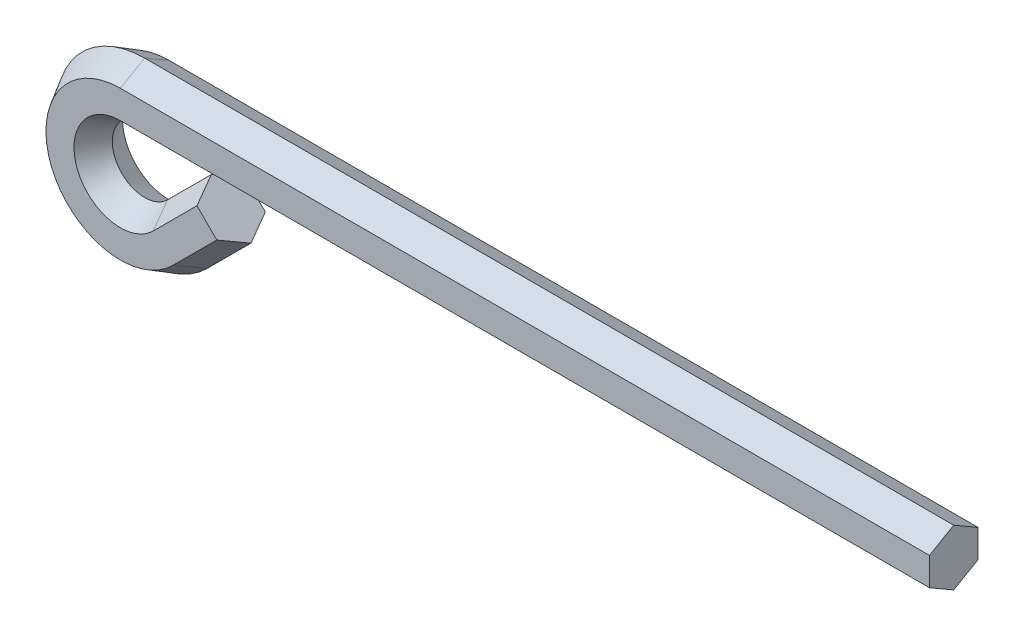
ISO-10303-21;
HEADER;
FILE_DESCRIPTION(('STEP AP214'),'2;1');
FILE_NAME('part.step','',(''),(''),'','','');
FILE_SCHEMA(('AUTOMOTIVE_DESIGN { 1 0 10303 214 1 1 1 1 }'));
ENDSEC;
DATA;
#1=APPLICATION_CONTEXT('core data for automotive mechanical design processes');
#2=APPLICATION_PROTOCOL_DEFINITION('international standard','automotive_design',2000,#1);
#3=PRODUCT_CONTEXT('',#1,'mechanical');
#4=PRODUCT('Part','Part','',(#3));
#5=PRODUCT_RELATED_PRODUCT_CATEGORY('part','',(#4));
#6=PRODUCT_DEFINITION_FORMATION('','',#4);
#7=PRODUCT_DEFINITION_CONTEXT('part definition',#1,'design');
#8=PRODUCT_DEFINITION('design','',#6,#7);
#9=PRODUCT_DEFINITION_SHAPE('','',#8);
#10=(LENGTH_UNIT() NAMED_UNIT(*) SI_UNIT(.MILLI.,.METRE.));
#11=(NAMED_UNIT(*) PLANE_ANGLE_UNIT() SI_UNIT($,.RADIAN.));
#12=(NAMED_UNIT(*) SI_UNIT($,.STERADIAN.) SOLID_ANGLE_UNIT());
#13=UNCERTAINTY_MEASURE_WITH_UNIT(LENGTH_MEASURE(1.E-05),#10,'distance_accuracy_value','');
#14=(GEOMETRIC_REPRESENTATION_CONTEXT(3) GLOBAL_UNCERTAINTY_ASSIGNED_CONTEXT((#13)) GLOBAL_UNIT_ASSIGNED_CONTEXT((#10,
#11,#12)) REPRESENTATION_CONTEXT('',''));
#15=CARTESIAN_POINT('',(0.,0.,0.));
#16=DIRECTION('',(0.,0.,1.));
#17=DIRECTION('',(1.,0.,0.));
#18=AXIS2_PLACEMENT_3D('',#15,#16,#17);
#19=CARTESIAN_POINT('',(6.50266173892101,-6.5026617389209,-3.));
#20=DIRECTION('',(-0.612372435695791,0.612372435695798,0.5));
#21=DIRECTION('',(-0.707106781186551,-0.707106781186544,0.));
#22=AXIS2_PLACEMENT_3D('',#19,#20,#21);
#23=PLANE('',#22);
#24=DIRECTION('',(0.353553390593277,-0.353553390593271,0.866025403784439));
#25=VECTOR('',#24,1.);
#26=CARTESIAN_POINT('',(6.50266173892101,-6.5026617389209,-3.));
#27=LINE('',#26,#25);
#28=CARTESIAN_POINT('',(6.50266173892101,-6.5026617389209,-3.));
#29=VERTEX_POINT('',#28);
#30=CARTESIAN_POINT('',(7.72740661031261,-7.72740661031248,0.));
#31=VERTEX_POINT('',#30);
#32=EDGE_CURVE('E133',#29,#31,#27,.T.);
#33=ORIENTED_EDGE('',*,*,#32,.F.);
#34=DIRECTION('',(0.707106781186551,0.707106781186544,0.));
#35=VECTOR('',#34,1.);
#36=CARTESIAN_POINT('',(6.50266173892101,-6.5026617389209,-3.));
#37=LINE('',#36,#35);
#38=CARTESIAN_POINT('',(11.9168753012942,-1.08844817654778,-3.));
#39=VERTEX_POINT('',#38);
#40=EDGE_CURVE('E42',#29,#39,#37,.T.);
#41=ORIENTED_EDGE('',*,*,#40,.T.);
#42=DIRECTION('',(0.353553390593277,-0.353553390593271,0.866025403784439));
#43=VECTOR('',#42,1.);
#44=CARTESIAN_POINT('',(11.9168753012942,-1.08844817654778,-3.));
#45=LINE('',#44,#43);
#46=CARTESIAN_POINT('',(13.1416201726858,-2.31319304793936,0.));
#47=VERTEX_POINT('',#46);
#48=EDGE_CURVE('E49',#39,#47,#45,.T.);
#49=ORIENTED_EDGE('',*,*,#48,.T.);
#50=DIRECTION('',(0.707106781186551,0.707106781186544,0.));
#51=VECTOR('',#50,1.);
#52=CARTESIAN_POINT('',(7.72740661031261,-7.72740661031248,0.));
#53=LINE('',#52,#51);
#54=EDGE_CURVE('E11',#31,#47,#53,.T.);
#55=ORIENTED_EDGE('',*,*,#54,.F.);
#56=EDGE_LOOP('',(#33,#41,#49,#55));
#57=FACE_BOUND('',#56,.T.);
#58=ADVANCED_FACE('F34',(#57),#23,.F.);
#59=CARTESIAN_POINT('',(2.82842712474621,-2.82842712474617,0.));
#60=DIRECTION('',(0.612372435695791,-0.612372435695798,0.5));
#61=DIRECTION('',(0.707106781186551,0.707106781186544,0.));
#62=AXIS2_PLACEMENT_3D('',#59,#60,#61);
#63=PLANE('',#62);
#64=DIRECTION('',(0.353553390593277,-0.353553390593271,-0.866025403784439));
#65=VECTOR('',#64,1.);
#66=CARTESIAN_POINT('',(2.82842712474621,-2.82842712474617,0.));
#67=LINE('',#66,#65);
#68=CARTESIAN_POINT('',(2.82842712474621,-2.82842712474617,0.));
#69=VERTEX_POINT('',#68);
#70=CARTESIAN_POINT('',(4.05317199613781,-4.05317199613775,-3.));
#71=VERTEX_POINT('',#70);
#72=EDGE_CURVE('E212',#69,#71,#67,.T.);
#73=ORIENTED_EDGE('',*,*,#72,.F.);
#74=DIRECTION('',(0.707106781186551,0.707106781186544,0.));
#75=VECTOR('',#74,1.);
#76=CARTESIAN_POINT('',(2.82842712474621,-2.82842712474617,0.));
#77=LINE('',#76,#75);
#78=CARTESIAN_POINT('',(8.24264068711939,2.58578643762695,0.));
#79=VERTEX_POINT('',#78);
#80=EDGE_CURVE('E256',#69,#79,#77,.T.);
#81=ORIENTED_EDGE('',*,*,#80,.T.);
#82=DIRECTION('',(0.353553390593277,-0.353553390593271,-0.866025403784439));
#83=VECTOR('',#82,1.);
#84=CARTESIAN_POINT('',(8.24264068711939,2.58578643762695,0.));
#85=LINE('',#84,#83);
#86=CARTESIAN_POINT('',(9.46738555851099,1.36104156623537,-3.));
#87=VERTEX_POINT('',#86);
#88=EDGE_CURVE('E243',#79,#87,#85,.T.);
#89=ORIENTED_EDGE('',*,*,#88,.T.);
#90=DIRECTION('',(0.707106781186551,0.707106781186544,0.));
#91=VECTOR('',#90,1.);
#92=CARTESIAN_POINT('',(4.05317199613781,-4.05317199613775,-3.));
#93=LINE('',#92,#91);
#94=EDGE_CURVE('E260',#71,#87,#93,.T.);
#95=ORIENTED_EDGE('',*,*,#94,.F.);
#96=EDGE_LOOP('',(#73,#81,#89,#95));
#97=FACE_BOUND('',#96,.T.);
#98=ADVANCED_FACE('F282',(#97),#63,.F.);
#99=CARTESIAN_POINT('',(2.82842712474621,-2.82842712474617,0.));
#100=DIRECTION('',(-0.612372435695791,0.612372435695798,0.5));
#101=DIRECTION('',(-0.707106781186551,-0.707106781186544,0.));
#102=AXIS2_PLACEMENT_3D('',#99,#100,#101);
#103=PLANE('',#102);
#104=DIRECTION('',(0.353553390593277,-0.353553390593271,0.866025403784439));
#105=VECTOR('',#104,1.);
#106=CARTESIAN_POINT('',(2.82842712474621,-2.82842712474617,0.));
#107=LINE('',#106,#105);
#108=CARTESIAN_POINT('',(4.05317199613781,-4.05317199613775,3.));
#109=VERTEX_POINT('',#108);
#110=EDGE_CURVE('E209',#69,#109,#107,.T.);
#111=ORIENTED_EDGE('',*,*,#110,.T.);
#112=DIRECTION('',(0.707106781186551,0.707106781186544,0.));
#113=VECTOR('',#112,1.);
#114=CARTESIAN_POINT('',(4.05317199613781,-4.05317199613775,3.));
#115=LINE('',#114,#113);
#116=CARTESIAN_POINT('',(9.46738555851099,1.36104156623537,3.));
#117=VERTEX_POINT('',#116);
#118=EDGE_CURVE('E252',#109,#117,#115,.T.);
#119=ORIENTED_EDGE('',*,*,#118,.T.);
#120=DIRECTION('',(0.353553390593277,-0.353553390593271,0.866025403784439));
#121=VECTOR('',#120,1.);
#122=CARTESIAN_POINT('',(8.24264068711939,2.58578643762695,0.));
#123=LINE('',#122,#121);
#124=EDGE_CURVE('E240',#79,#117,#123,.T.);
#125=ORIENTED_EDGE('',*,*,#124,.F.);
#126=ORIENTED_EDGE('',*,*,#80,.F.);
#127=EDGE_LOOP('',(#111,#119,#125,#126));
#128=FACE_BOUND('',#127,.T.);
#129=ADVANCED_FACE('F286',(#128),#103,.T.);
#130=CARTESIAN_POINT('',(6.50266173892101,-6.5026617389209,3.));
#131=DIRECTION('',(0.612372435695791,-0.612372435695798,0.5));
#132=DIRECTION('',(0.707106781186551,0.707106781186544,0.));
#133=AXIS2_PLACEMENT_3D('',#130,#131,#132);
#134=PLANE('',#133);
#135=DIRECTION('',(0.353553390593277,-0.353553390593271,-0.866025403784439));
#136=VECTOR('',#135,1.);
#137=CARTESIAN_POINT('',(6.50266173892101,-6.5026617389209,3.));
#138=LINE('',#137,#136);
#139=CARTESIAN_POINT('',(6.50266173892101,-6.5026617389209,3.));
#140=VERTEX_POINT('',#139);
#141=EDGE_CURVE('E160',#140,#31,#138,.T.);
#142=ORIENTED_EDGE('',*,*,#141,.T.);
#143=ORIENTED_EDGE('',*,*,#54,.T.);
#144=DIRECTION('',(0.353553390593277,-0.353553390593271,-0.866025403784439));
#145=VECTOR('',#144,1.);
#146=CARTESIAN_POINT('',(11.9168753012942,-1.08844817654778,3.));
#147=LINE('',#146,#145);
#148=CARTESIAN_POINT('',(11.9168753012942,-1.08844817654778,3.));
#149=VERTEX_POINT('',#148);
#150=EDGE_CURVE('E137',#149,#47,#147,.T.);
#151=ORIENTED_EDGE('',*,*,#150,.F.);
#152=DIRECTION('',(0.707106781186551,0.707106781186544,0.));
#153=VECTOR('',#152,1.);
#154=CARTESIAN_POINT('',(6.50266173892101,-6.5026617389209,3.));
#155=LINE('',#154,#153);
#156=EDGE_CURVE('E249',#140,#149,#155,.T.);
#157=ORIENTED_EDGE('',*,*,#156,.F.);
#158=EDGE_LOOP('',(#142,#143,#151,#157));
#159=FACE_BOUND('',#158,.T.);
#160=ADVANCED_FACE('F291',(#159),#134,.T.);
#161=CARTESIAN_POINT('',(0.,0.,-3.));
#162=DIRECTION('',(0.,0.,1.));
#163=DIRECTION('',(1.,0.,0.));
#164=AXIS2_PLACEMENT_3D('',#161,#162,#163);
#165=CONICAL_SURFACE('',#164,9.19615242270663,0.523598775598299);
#166=DIRECTION('',(0.,0.5,0.866025403784439));
#167=VECTOR('',#166,1.);
#168=CARTESIAN_POINT('',(0.,9.19615242270663,-3.));
#169=LINE('',#168,#167);
#170=CARTESIAN_POINT('',(0.,9.19615242270663,-3.));
#171=VERTEX_POINT('',#170);
#172=CARTESIAN_POINT('',(0.,10.9282032302755,0.));
#173=VERTEX_POINT('',#172);
#174=EDGE_CURVE('E130',#171,#173,#169,.T.);
#175=ORIENTED_EDGE('',*,*,#174,.F.);
#176=CARTESIAN_POINT('',(0.,0.,-3.));
#177=DIRECTION('',(0.,0.,1.));
#178=DIRECTION('',(1.,0.,0.));
#179=AXIS2_PLACEMENT_3D('',#176,#177,#178);
#180=CIRCLE('',#179,9.19615242270663);
#181=EDGE_CURVE('E138',#171,#29,#180,.T.);
#182=ORIENTED_EDGE('',*,*,#181,.T.);
#183=ORIENTED_EDGE('',*,*,#32,.T.);
#184=CARTESIAN_POINT('',(0.,0.,0.));
#185=DIRECTION('',(0.,0.,1.));
#186=DIRECTION('',(1.,0.,0.));
#187=AXIS2_PLACEMENT_3D('',#184,#185,#186);
#188=CIRCLE('',#187,10.9282032302755);
#189=EDGE_CURVE('E125',#173,#31,#188,.T.);
#190=ORIENTED_EDGE('',*,*,#189,.F.);
#191=EDGE_LOOP('',(#175,#182,#183,#190));
#192=FACE_BOUND('',#191,.T.);
#193=ADVANCED_FACE('F127',(#192),#165,.T.);
#194=CARTESIAN_POINT('',(0.,0.,0.));
#195=DIRECTION('',(0.,0.,-1.));
#196=DIRECTION('',(-1.,0.,0.));
#197=AXIS2_PLACEMENT_3D('',#194,#195,#196);
#198=CONICAL_SURFACE('',#197,4.,0.523598775598299);
#199=DIRECTION('',(0.,0.5,-0.866025403784439));
#200=VECTOR('',#199,1.);
#201=CARTESIAN_POINT('',(0.,4.,0.));
#202=LINE('',#201,#200);
#203=CARTESIAN_POINT('',(0.,4.,0.));
#204=VERTEX_POINT('',#203);
#205=CARTESIAN_POINT('',(0.,5.73205080756888,-3.));
#206=VERTEX_POINT('',#205);
#207=EDGE_CURVE('E165',#204,#206,#202,.T.);
#208=ORIENTED_EDGE('',*,*,#207,.F.);
#209=CARTESIAN_POINT('',(0.,0.,0.));
#210=DIRECTION('',(0.,0.,1.));
#211=DIRECTION('',(1.,0.,0.));
#212=AXIS2_PLACEMENT_3D('',#209,#210,#211);
#213=CIRCLE('',#212,4.);
#214=EDGE_CURVE('E224',#204,#69,#213,.T.);
#215=ORIENTED_EDGE('',*,*,#214,.T.);
#216=ORIENTED_EDGE('',*,*,#72,.T.);
#217=CARTESIAN_POINT('',(0.,0.,-3.));
#218=DIRECTION('',(0.,0.,1.));
#219=DIRECTION('',(1.,0.,0.));
#220=AXIS2_PLACEMENT_3D('',#217,#218,#219);
#221=CIRCLE('',#220,5.73205080756888);
#222=EDGE_CURVE('E228',#206,#71,#221,.T.);
#223=ORIENTED_EDGE('',*,*,#222,.F.);
#224=EDGE_LOOP('',(#208,#215,#216,#223));
#225=FACE_BOUND('',#224,.T.);
#226=ADVANCED_FACE('F278',(#225),#198,.F.);
#227=CARTESIAN_POINT('',(0.,0.,0.));
#228=DIRECTION('',(0.,0.,1.));
#229=DIRECTION('',(1.,0.,0.));
#230=AXIS2_PLACEMENT_3D('',#227,#228,#229);
#231=CONICAL_SURFACE('',#230,4.,0.523598775598299);
#232=DIRECTION('',(0.,0.5,0.866025403784439));
#233=VECTOR('',#232,1.);
#234=CARTESIAN_POINT('',(0.,4.,0.));
#235=LINE('',#234,#233);
#236=CARTESIAN_POINT('',(0.,5.73205080756888,3.));
#237=VERTEX_POINT('',#236);
#238=EDGE_CURVE('E172',#204,#237,#235,.T.);
#239=ORIENTED_EDGE('',*,*,#238,.T.);
#240=CARTESIAN_POINT('',(0.,0.,3.));
#241=DIRECTION('',(0.,0.,1.));
#242=DIRECTION('',(1.,0.,0.));
#243=AXIS2_PLACEMENT_3D('',#240,#241,#242);
#244=CIRCLE('',#243,5.73205080756888);
#245=EDGE_CURVE('E220',#237,#109,#244,.T.);
#246=ORIENTED_EDGE('',*,*,#245,.T.);
#247=ORIENTED_EDGE('',*,*,#110,.F.);
#248=ORIENTED_EDGE('',*,*,#214,.F.);
#249=EDGE_LOOP('',(#239,#246,#247,#248));
#250=FACE_BOUND('',#249,.T.);
#251=ADVANCED_FACE('F284',(#250),#231,.F.);
#252=CARTESIAN_POINT('',(0.,0.,3.));
#253=DIRECTION('',(0.,0.,-1.));
#254=DIRECTION('',(-1.,0.,0.));
#255=AXIS2_PLACEMENT_3D('',#252,#253,#254);
#256=CONICAL_SURFACE('',#255,9.19615242270663,0.523598775598299);
#257=DIRECTION('',(0.,0.5,-0.866025403784439));
#258=VECTOR('',#257,1.);
#259=CARTESIAN_POINT('',(0.,9.19615242270663,3.));
#260=LINE('',#259,#258);
#261=CARTESIAN_POINT('',(0.,9.19615242270663,3.));
#262=VERTEX_POINT('',#261);
#263=EDGE_CURVE('E141',#262,#173,#260,.T.);
#264=ORIENTED_EDGE('',*,*,#263,.T.);
#265=ORIENTED_EDGE('',*,*,#189,.T.);
#266=ORIENTED_EDGE('',*,*,#141,.F.);
#267=CARTESIAN_POINT('',(0.,0.,3.));
#268=DIRECTION('',(0.,0.,1.));
#269=DIRECTION('',(1.,0.,0.));
#270=AXIS2_PLACEMENT_3D('',#267,#268,#269);
#271=CIRCLE('',#270,9.19615242270663);
#272=EDGE_CURVE('E145',#262,#140,#271,.T.);
#273=ORIENTED_EDGE('',*,*,#272,.F.);
#274=EDGE_LOOP('',(#264,#265,#266,#273));
#275=FACE_BOUND('',#274,.T.);
#276=ADVANCED_FACE('F143',(#275),#256,.T.);
#277=CARTESIAN_POINT('',(0.,9.19615242270663,3.));
#278=DIRECTION('',(0.,-0.866025403784438,-0.5));
#279=DIRECTION('',(0.,0.5,-0.866025403784438));
#280=AXIS2_PLACEMENT_3D('',#277,#278,#279);
#281=PLANE('',#280);
#282=DIRECTION('',(0.,0.5,-0.866025403784439));
#283=VECTOR('',#282,1.);
#284=CARTESIAN_POINT('',(100.,9.19615242270662,3.));
#285=LINE('',#284,#283);
#286=CARTESIAN_POINT('',(100.,9.19615242270662,3.));
#287=VERTEX_POINT('',#286);
#288=CARTESIAN_POINT('',(100.,10.9282032302755,0.));
#289=VERTEX_POINT('',#288);
#290=EDGE_CURVE('E155',#287,#289,#285,.T.);
#291=ORIENTED_EDGE('',*,*,#290,.T.);
#292=DIRECTION('',(1.,0.,0.));
#293=VECTOR('',#292,1.);
#294=CARTESIAN_POINT('',(0.,10.9282032302755,0.));
#295=LINE('',#294,#293);
#296=EDGE_CURVE('E152',#173,#289,#295,.T.);
#297=ORIENTED_EDGE('',*,*,#296,.F.);
#298=ORIENTED_EDGE('',*,*,#263,.F.);
#299=DIRECTION('',(1.,0.,0.));
#300=VECTOR('',#299,1.);
#301=CARTESIAN_POINT('',(0.,9.19615242270663,3.));
#302=LINE('',#301,#300);
#303=EDGE_CURVE('E177',#262,#287,#302,.T.);
#304=ORIENTED_EDGE('',*,*,#303,.T.);
#305=EDGE_LOOP('',(#291,#297,#298,#304));
#306=FACE_BOUND('',#305,.T.);
#307=ADVANCED_FACE('F153',(#306),#281,.F.);
#308=CARTESIAN_POINT('',(0.,9.19615242270663,-3.));
#309=DIRECTION('',(0.,0.866025403784438,-0.5));
#310=DIRECTION('',(0.,0.5,0.866025403784438));
#311=AXIS2_PLACEMENT_3D('',#308,#309,#310);
#312=PLANE('',#311);
#313=DIRECTION('',(0.,0.5,0.866025403784439));
#314=VECTOR('',#313,1.);
#315=CARTESIAN_POINT('',(100.,9.19615242270662,-3.));
#316=LINE('',#315,#314);
#317=CARTESIAN_POINT('',(100.,9.19615242270662,-3.));
#318=VERTEX_POINT('',#317);
#319=EDGE_CURVE('E179',#318,#289,#316,.T.);
#320=ORIENTED_EDGE('',*,*,#319,.F.);
#321=DIRECTION('',(1.,0.,0.));
#322=VECTOR('',#321,1.);
#323=CARTESIAN_POINT('',(0.,9.19615242270663,-3.));
#324=LINE('',#323,#322);
#325=EDGE_CURVE('E161',#171,#318,#324,.T.);
#326=ORIENTED_EDGE('',*,*,#325,.F.);
#327=ORIENTED_EDGE('',*,*,#174,.T.);
#328=ORIENTED_EDGE('',*,*,#296,.T.);
#329=EDGE_LOOP('',(#320,#326,#327,#328));
#330=FACE_BOUND('',#329,.T.);
#331=ADVANCED_FACE('F163',(#330),#312,.T.);
#332=CARTESIAN_POINT('',(0.,5.73205080756888,-3.));
#333=DIRECTION('',(0.,0.,-1.));
#334=DIRECTION('',(-1.,0.,0.));
#335=AXIS2_PLACEMENT_3D('',#332,#333,#334);
#336=PLANE('',#335);
#337=DIRECTION('',(0.,1.,0.));
#338=VECTOR('',#337,1.);
#339=CARTESIAN_POINT('',(100.,5.73205080756887,-3.));
#340=LINE('',#339,#338);
#341=CARTESIAN_POINT('',(100.,5.73205080756887,-3.));
#342=VERTEX_POINT('',#341);
#343=EDGE_CURVE('E182',#342,#318,#340,.T.);
#344=ORIENTED_EDGE('',*,*,#343,.F.);
#345=DIRECTION('',(1.,0.,0.));
#346=VECTOR('',#345,1.);
#347=CARTESIAN_POINT('',(0.,5.73205080756888,-3.));
#348=LINE('',#347,#346);
#349=EDGE_CURVE('E201',#206,#342,#348,.T.);
#350=ORIENTED_EDGE('',*,*,#349,.F.);
#351=ORIENTED_EDGE('',*,*,#222,.T.);
#352=ORIENTED_EDGE('',*,*,#94,.T.);
#353=DIRECTION('',(0.707106781186553,-0.707106781186542,0.));
#354=VECTOR('',#353,1.);
#355=CARTESIAN_POINT('',(9.46738555851099,1.36104156623537,-3.));
#356=LINE('',#355,#354);
#357=EDGE_CURVE('E57',#87,#39,#356,.T.);
#358=ORIENTED_EDGE('',*,*,#357,.T.);
#359=ORIENTED_EDGE('',*,*,#40,.F.);
#360=ORIENTED_EDGE('',*,*,#181,.F.);
#361=ORIENTED_EDGE('',*,*,#325,.T.);
#362=EDGE_LOOP('',(#344,#350,#351,#352,#358,#359,#360,#361));
#363=FACE_BOUND('',#362,.T.);
#364=ADVANCED_FACE('F265',(#363),#336,.T.);
#365=CARTESIAN_POINT('',(0.,4.,0.));
#366=DIRECTION('',(0.,-0.866025403784439,-0.5));
#367=DIRECTION('',(0.,0.5,-0.866025403784439));
#368=AXIS2_PLACEMENT_3D('',#365,#366,#367);
#369=PLANE('',#368);
#370=DIRECTION('',(0.,0.5,-0.866025403784439));
#371=VECTOR('',#370,1.);
#372=CARTESIAN_POINT('',(100.,3.99999999999999,0.));
#373=LINE('',#372,#371);
#374=CARTESIAN_POINT('',(100.,3.99999999999999,0.));
#375=VERTEX_POINT('',#374);
#376=EDGE_CURVE('E185',#375,#342,#373,.T.);
#377=ORIENTED_EDGE('',*,*,#376,.F.);
#378=DIRECTION('',(1.,0.,0.));
#379=VECTOR('',#378,1.);
#380=CARTESIAN_POINT('',(0.,4.,0.));
#381=LINE('',#380,#379);
#382=EDGE_CURVE('E198',#204,#375,#381,.T.);
#383=ORIENTED_EDGE('',*,*,#382,.F.);
#384=ORIENTED_EDGE('',*,*,#207,.T.);
#385=ORIENTED_EDGE('',*,*,#349,.T.);
#386=EDGE_LOOP('',(#377,#383,#384,#385));
#387=FACE_BOUND('',#386,.T.);
#388=ADVANCED_FACE('F274',(#387),#369,.T.);
#389=CARTESIAN_POINT('',(0.,4.,0.));
#390=DIRECTION('',(0.,0.866025403784439,-0.5));
#391=DIRECTION('',(0.,0.5,0.866025403784439));
#392=AXIS2_PLACEMENT_3D('',#389,#390,#391);
#393=PLANE('',#392);
#394=DIRECTION('',(0.,0.5,0.866025403784439));
#395=VECTOR('',#394,1.);
#396=CARTESIAN_POINT('',(100.,3.99999999999999,0.));
#397=LINE('',#396,#395);
#398=CARTESIAN_POINT('',(100.,5.73205080756887,3.));
#399=VERTEX_POINT('',#398);
#400=EDGE_CURVE('E188',#375,#399,#397,.T.);
#401=ORIENTED_EDGE('',*,*,#400,.T.);
#402=DIRECTION('',(1.,0.,0.));
#403=VECTOR('',#402,1.);
#404=CARTESIAN_POINT('',(0.,5.73205080756888,3.));
#405=LINE('',#404,#403);
#406=EDGE_CURVE('E194',#237,#399,#405,.T.);
#407=ORIENTED_EDGE('',*,*,#406,.F.);
#408=ORIENTED_EDGE('',*,*,#238,.F.);
#409=ORIENTED_EDGE('',*,*,#382,.T.);
#410=EDGE_LOOP('',(#401,#407,#408,#409));
#411=FACE_BOUND('',#410,.T.);
#412=ADVANCED_FACE('F296',(#411),#393,.F.);
#413=CARTESIAN_POINT('',(0.,5.73205080756888,3.));
#414=DIRECTION('',(0.,0.,-1.));
#415=DIRECTION('',(-1.,0.,0.));
#416=AXIS2_PLACEMENT_3D('',#413,#414,#415);
#417=PLANE('',#416);
#418=DIRECTION('',(0.,1.,0.));
#419=VECTOR('',#418,1.);
#420=CARTESIAN_POINT('',(100.,5.73205080756887,3.));
#421=LINE('',#420,#419);
#422=EDGE_CURVE('E149',#399,#287,#421,.T.);
#423=ORIENTED_EDGE('',*,*,#422,.T.);
#424=ORIENTED_EDGE('',*,*,#303,.F.);
#425=ORIENTED_EDGE('',*,*,#272,.T.);
#426=ORIENTED_EDGE('',*,*,#156,.T.);
#427=DIRECTION('',(0.707106781186553,-0.707106781186542,0.));
#428=VECTOR('',#427,1.);
#429=CARTESIAN_POINT('',(9.46738555851099,1.36104156623537,3.));
#430=LINE('',#429,#428);
#431=EDGE_CURVE('E236',#117,#149,#430,.T.);
#432=ORIENTED_EDGE('',*,*,#431,.F.);
#433=ORIENTED_EDGE('',*,*,#118,.F.);
#434=ORIENTED_EDGE('',*,*,#245,.F.);
#435=ORIENTED_EDGE('',*,*,#406,.T.);
#436=EDGE_LOOP('',(#423,#424,#425,#426,#432,#433,#434,#435));
#437=FACE_BOUND('',#436,.T.);
#438=ADVANCED_FACE('F293',(#437),#417,.F.);
#439=CARTESIAN_POINT('',(13.1416201726858,-2.31319304793936,0.));
#440=DIRECTION('',(-0.707106781186542,-0.707106781186553,0.));
#441=DIRECTION('',(0.,0.,-1.));
#442=AXIS2_PLACEMENT_3D('',#439,#440,#441);
#443=PLANE('',#442);
#444=ORIENTED_EDGE('',*,*,#150,.T.);
#445=ORIENTED_EDGE('',*,*,#48,.F.);
#446=ORIENTED_EDGE('',*,*,#357,.F.);
#447=ORIENTED_EDGE('',*,*,#88,.F.);
#448=ORIENTED_EDGE('',*,*,#124,.T.);
#449=ORIENTED_EDGE('',*,*,#431,.T.);
#450=EDGE_LOOP('',(#444,#445,#446,#447,#448,#449));
#451=FACE_BOUND('',#450,.T.);
#452=ADVANCED_FACE('F289',(#451),#443,.F.);
#453=CARTESIAN_POINT('',(100.,10.9282032302755,0.));
#454=DIRECTION('',(1.,0.,0.));
#455=DIRECTION('',(0.,0.,-1.));
#456=AXIS2_PLACEMENT_3D('',#453,#454,#455);
#457=PLANE('',#456);
#458=ORIENTED_EDGE('',*,*,#290,.F.);
#459=ORIENTED_EDGE('',*,*,#422,.F.);
#460=ORIENTED_EDGE('',*,*,#400,.F.);
#461=ORIENTED_EDGE('',*,*,#376,.T.);
#462=ORIENTED_EDGE('',*,*,#343,.T.);
#463=ORIENTED_EDGE('',*,*,#319,.T.);
#464=EDGE_LOOP('',(#458,#459,#460,#461,#462,#463));
#465=FACE_BOUND('',#464,.T.);
#466=ADVANCED_FACE('F268',(#465),#457,.T.);
#467=CLOSED_SHELL('',(#58,#98,#129,#160,#193,#226,#251,#276,#307,#331,#364,#388,#412,#438,#452,#466));
#468=MANIFOLD_SOLID_BREP('B2',#467);
#469=ADVANCED_BREP_SHAPE_REPRESENTATION('',(#18,#468),#14);
#470=SHAPE_DEFINITION_REPRESENTATION(#9,#469);
ENDSEC;
END-ISO-10303-21;
